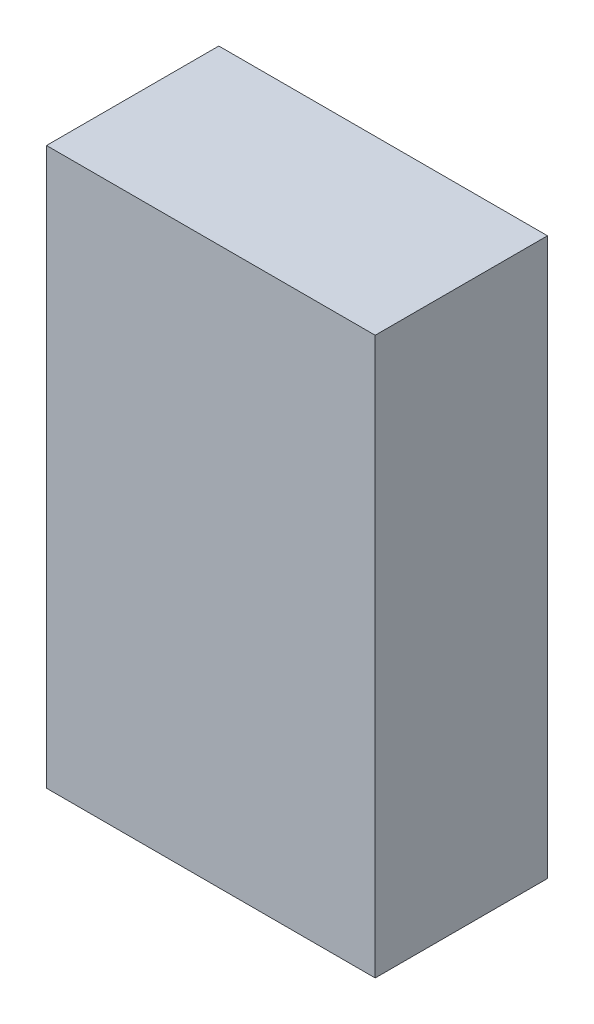
ISO-10303-21;
HEADER;
FILE_DESCRIPTION(('STEP AP214'),'2;1');
FILE_NAME('part.step','',(''),(''),'','','');
FILE_SCHEMA(('AUTOMOTIVE_DESIGN { 1 0 10303 214 1 1 1 1 }'));
ENDSEC;
DATA;
#1=APPLICATION_CONTEXT('core data for automotive mechanical design processes');
#2=APPLICATION_PROTOCOL_DEFINITION('international standard','automotive_design',2000,#1);
#3=PRODUCT_CONTEXT('',#1,'mechanical');
#4=PRODUCT('Part','Part','',(#3));
#5=PRODUCT_RELATED_PRODUCT_CATEGORY('part','',(#4));
#6=PRODUCT_DEFINITION_FORMATION('','',#4);
#7=PRODUCT_DEFINITION_CONTEXT('part definition',#1,'design');
#8=PRODUCT_DEFINITION('design','',#6,#7);
#9=PRODUCT_DEFINITION_SHAPE('','',#8);
#10=(LENGTH_UNIT() NAMED_UNIT(*) SI_UNIT(.MILLI.,.METRE.));
#11=(NAMED_UNIT(*) PLANE_ANGLE_UNIT() SI_UNIT($,.RADIAN.));
#12=(NAMED_UNIT(*) SI_UNIT($,.STERADIAN.) SOLID_ANGLE_UNIT());
#13=UNCERTAINTY_MEASURE_WITH_UNIT(LENGTH_MEASURE(1.E-05),#10,'distance_accuracy_value','');
#14=(GEOMETRIC_REPRESENTATION_CONTEXT(3) GLOBAL_UNCERTAINTY_ASSIGNED_CONTEXT((#13)) GLOBAL_UNIT_ASSIGNED_CONTEXT((#10,
#11,#12)) REPRESENTATION_CONTEXT('',''));
#15=CARTESIAN_POINT('',(0.,0.,0.));
#16=DIRECTION('',(0.,0.,1.));
#17=DIRECTION('',(1.,0.,0.));
#18=AXIS2_PLACEMENT_3D('',#15,#16,#17);
#19=CARTESIAN_POINT('',(-128.8,57.,207.75));
#20=DIRECTION('',(0.,0.,1.));
#21=DIRECTION('',(1.,0.,0.));
#22=AXIS2_PLACEMENT_3D('',#19,#20,#21);
#23=PLANE('',#22);
#24=DIRECTION('',(-1.,0.,0.));
#25=VECTOR('',#24,1.);
#26=CARTESIAN_POINT('',(-128.8,57.,207.75));
#27=LINE('',#26,#25);
#28=CARTESIAN_POINT('',(-128.8,57.,207.75));
#29=VERTEX_POINT('',#28);
#30=CARTESIAN_POINT('',(-141.2,57.,207.75));
#31=VERTEX_POINT('',#30);
#32=EDGE_CURVE('E77',#29,#31,#27,.T.);
#33=ORIENTED_EDGE('',*,*,#32,.F.);
#34=DIRECTION('',(0.,1.,0.));
#35=VECTOR('',#34,1.);
#36=CARTESIAN_POINT('',(-128.8,57.,207.75));
#37=LINE('',#36,#35);
#38=CARTESIAN_POINT('',(-128.8,78.,207.75));
#39=VERTEX_POINT('',#38);
#40=EDGE_CURVE('E62',#29,#39,#37,.T.);
#41=ORIENTED_EDGE('',*,*,#40,.T.);
#42=DIRECTION('',(-1.,0.,0.));
#43=VECTOR('',#42,1.);
#44=CARTESIAN_POINT('',(-128.8,78.,207.75));
#45=LINE('',#44,#43);
#46=CARTESIAN_POINT('',(-141.2,78.,207.75));
#47=VERTEX_POINT('',#46);
#48=EDGE_CURVE('E71',#39,#47,#45,.T.);
#49=ORIENTED_EDGE('',*,*,#48,.T.);
#50=DIRECTION('',(0.,1.,0.));
#51=VECTOR('',#50,1.);
#52=CARTESIAN_POINT('',(-141.2,57.,207.75));
#53=LINE('',#52,#51);
#54=EDGE_CURVE('E10',#31,#47,#53,.T.);
#55=ORIENTED_EDGE('',*,*,#54,.F.);
#56=EDGE_LOOP('',(#33,#41,#49,#55));
#57=FACE_BOUND('',#56,.T.);
#58=ADVANCED_FACE('F15',(#57),#23,.T.);
#59=CARTESIAN_POINT('',(-128.8,57.,201.25));
#60=DIRECTION('',(0.,0.,1.));
#61=DIRECTION('',(1.,0.,0.));
#62=AXIS2_PLACEMENT_3D('',#59,#60,#61);
#63=PLANE('',#62);
#64=DIRECTION('',(0.,1.,0.));
#65=VECTOR('',#64,1.);
#66=CARTESIAN_POINT('',(-141.2,57.,201.25));
#67=LINE('',#66,#65);
#68=CARTESIAN_POINT('',(-141.2,57.,201.25));
#69=VERTEX_POINT('',#68);
#70=CARTESIAN_POINT('',(-141.2,78.,201.25));
#71=VERTEX_POINT('',#70);
#72=EDGE_CURVE('E26',#69,#71,#67,.T.);
#73=ORIENTED_EDGE('',*,*,#72,.T.);
#74=DIRECTION('',(-1.,0.,0.));
#75=VECTOR('',#74,1.);
#76=CARTESIAN_POINT('',(-128.8,78.,201.25));
#77=LINE('',#76,#75);
#78=CARTESIAN_POINT('',(-128.8,78.,201.25));
#79=VERTEX_POINT('',#78);
#80=EDGE_CURVE('E91',#79,#71,#77,.T.);
#81=ORIENTED_EDGE('',*,*,#80,.F.);
#82=DIRECTION('',(0.,1.,0.));
#83=VECTOR('',#82,1.);
#84=CARTESIAN_POINT('',(-128.8,57.,201.25));
#85=LINE('',#84,#83);
#86=CARTESIAN_POINT('',(-128.8,57.,201.25));
#87=VERTEX_POINT('',#86);
#88=EDGE_CURVE('E19',#87,#79,#85,.T.);
#89=ORIENTED_EDGE('',*,*,#88,.F.);
#90=DIRECTION('',(-1.,0.,0.));
#91=VECTOR('',#90,1.);
#92=CARTESIAN_POINT('',(-128.8,57.,201.25));
#93=LINE('',#92,#91);
#94=EDGE_CURVE('E79',#87,#69,#93,.T.);
#95=ORIENTED_EDGE('',*,*,#94,.T.);
#96=EDGE_LOOP('',(#73,#81,#89,#95));
#97=FACE_BOUND('',#96,.T.);
#98=ADVANCED_FACE('F107',(#97),#63,.F.);
#99=CARTESIAN_POINT('',(-141.2,57.,201.25));
#100=DIRECTION('',(-1.,0.,0.));
#101=DIRECTION('',(0.,0.,1.));
#102=AXIS2_PLACEMENT_3D('',#99,#100,#101);
#103=PLANE('',#102);
#104=ORIENTED_EDGE('',*,*,#72,.F.);
#105=DIRECTION('',(0.,0.,1.));
#106=VECTOR('',#105,1.);
#107=CARTESIAN_POINT('',(-141.2,57.,201.25));
#108=LINE('',#107,#106);
#109=EDGE_CURVE('E83',#69,#31,#108,.T.);
#110=ORIENTED_EDGE('',*,*,#109,.T.);
#111=ORIENTED_EDGE('',*,*,#54,.T.);
#112=DIRECTION('',(0.,0.,1.));
#113=VECTOR('',#112,1.);
#114=CARTESIAN_POINT('',(-141.2,78.,201.25));
#115=LINE('',#114,#113);
#116=EDGE_CURVE('E93',#71,#47,#115,.T.);
#117=ORIENTED_EDGE('',*,*,#116,.F.);
#118=EDGE_LOOP('',(#104,#110,#111,#117));
#119=FACE_BOUND('',#118,.T.);
#120=ADVANCED_FACE('F109',(#119),#103,.T.);
#121=CARTESIAN_POINT('',(-128.8,57.,201.25));
#122=DIRECTION('',(-1.,0.,0.));
#123=DIRECTION('',(0.,0.,1.));
#124=AXIS2_PLACEMENT_3D('',#121,#122,#123);
#125=PLANE('',#124);
#126=DIRECTION('',(0.,0.,1.));
#127=VECTOR('',#126,1.);
#128=CARTESIAN_POINT('',(-128.8,78.,201.25));
#129=LINE('',#128,#127);
#130=EDGE_CURVE('E68',#79,#39,#129,.T.);
#131=ORIENTED_EDGE('',*,*,#130,.T.);
#132=ORIENTED_EDGE('',*,*,#40,.F.);
#133=DIRECTION('',(0.,0.,1.));
#134=VECTOR('',#133,1.);
#135=CARTESIAN_POINT('',(-128.8,57.,201.25));
#136=LINE('',#135,#134);
#137=EDGE_CURVE('E65',#87,#29,#136,.T.);
#138=ORIENTED_EDGE('',*,*,#137,.F.);
#139=ORIENTED_EDGE('',*,*,#88,.T.);
#140=EDGE_LOOP('',(#131,#132,#138,#139));
#141=FACE_BOUND('',#140,.T.);
#142=ADVANCED_FACE('F17',(#141),#125,.F.);
#143=CARTESIAN_POINT('',(-128.8,78.,201.25));
#144=DIRECTION('',(0.,1.,0.));
#145=DIRECTION('',(1.,0.,0.));
#146=AXIS2_PLACEMENT_3D('',#143,#144,#145);
#147=PLANE('',#146);
#148=ORIENTED_EDGE('',*,*,#130,.F.);
#149=ORIENTED_EDGE('',*,*,#80,.T.);
#150=ORIENTED_EDGE('',*,*,#116,.T.);
#151=ORIENTED_EDGE('',*,*,#48,.F.);
#152=EDGE_LOOP('',(#148,#149,#150,#151));
#153=FACE_BOUND('',#152,.T.);
#154=ADVANCED_FACE('F111',(#153),#147,.T.);
#155=CARTESIAN_POINT('',(-128.8,57.,201.25));
#156=DIRECTION('',(0.,1.,0.));
#157=DIRECTION('',(1.,0.,0.));
#158=AXIS2_PLACEMENT_3D('',#155,#156,#157);
#159=PLANE('',#158);
#160=ORIENTED_EDGE('',*,*,#32,.T.);
#161=ORIENTED_EDGE('',*,*,#109,.F.);
#162=ORIENTED_EDGE('',*,*,#94,.F.);
#163=ORIENTED_EDGE('',*,*,#137,.T.);
#164=EDGE_LOOP('',(#160,#161,#162,#163));
#165=FACE_BOUND('',#164,.T.);
#166=ADVANCED_FACE('F75',(#165),#159,.F.);
#167=CLOSED_SHELL('',(#58,#98,#120,#142,#154,#166));
#168=MANIFOLD_SOLID_BREP('B1',#167);
#169=ADVANCED_BREP_SHAPE_REPRESENTATION('',(#18,#168),#14);
#170=SHAPE_DEFINITION_REPRESENTATION(#9,#169);
ENDSEC;
END-ISO-10303-21;
